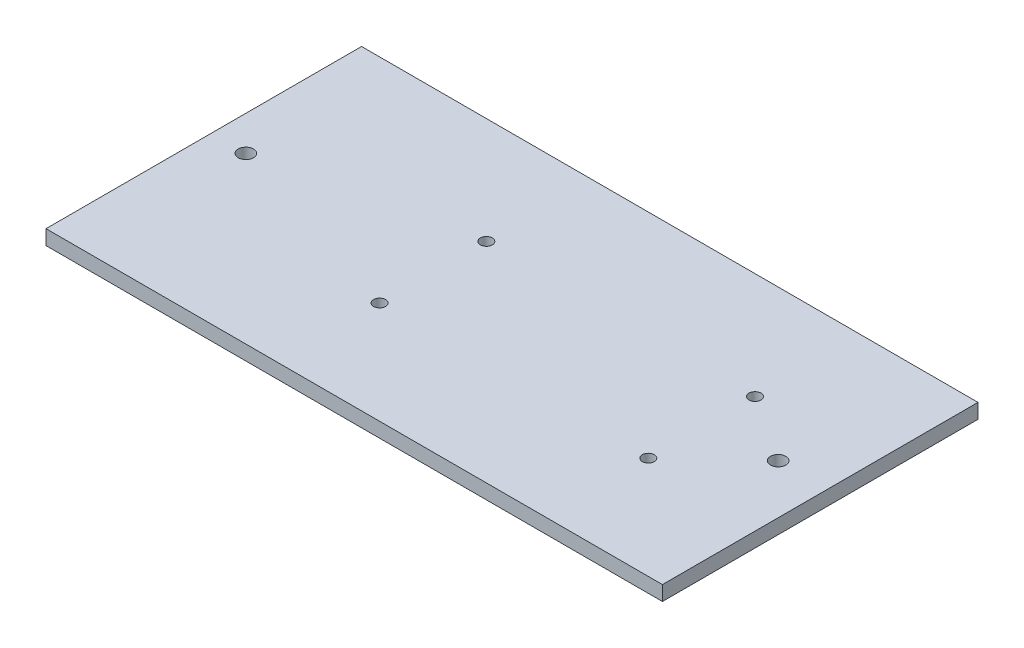
ISO-10303-21;
HEADER;
FILE_DESCRIPTION(('STEP AP214'),'2;1');
FILE_NAME('part.step','',(''),(''),'','','');
FILE_SCHEMA(('AUTOMOTIVE_DESIGN { 1 0 10303 214 1 1 1 1 }'));
ENDSEC;
DATA;
#1=APPLICATION_CONTEXT('core data for automotive mechanical design processes');
#2=APPLICATION_PROTOCOL_DEFINITION('international standard','automotive_design',2000,#1);
#3=PRODUCT_CONTEXT('',#1,'mechanical');
#4=PRODUCT('Part','Part','',(#3));
#5=PRODUCT_RELATED_PRODUCT_CATEGORY('part','',(#4));
#6=PRODUCT_DEFINITION_FORMATION('','',#4);
#7=PRODUCT_DEFINITION_CONTEXT('part definition',#1,'design');
#8=PRODUCT_DEFINITION('design','',#6,#7);
#9=PRODUCT_DEFINITION_SHAPE('','',#8);
#10=(LENGTH_UNIT() NAMED_UNIT(*) SI_UNIT(.MILLI.,.METRE.));
#11=(NAMED_UNIT(*) PLANE_ANGLE_UNIT() SI_UNIT($,.RADIAN.));
#12=(NAMED_UNIT(*) SI_UNIT($,.STERADIAN.) SOLID_ANGLE_UNIT());
#13=UNCERTAINTY_MEASURE_WITH_UNIT(LENGTH_MEASURE(1.E-05),#10,'distance_accuracy_value','');
#14=(GEOMETRIC_REPRESENTATION_CONTEXT(3) GLOBAL_UNCERTAINTY_ASSIGNED_CONTEXT((#13)) GLOBAL_UNIT_ASSIGNED_CONTEXT((#10,
#11,#12)) REPRESENTATION_CONTEXT('',''));
#15=CARTESIAN_POINT('',(0.,0.,0.));
#16=DIRECTION('',(0.,0.,1.));
#17=DIRECTION('',(1.,0.,0.));
#18=AXIS2_PLACEMENT_3D('',#15,#16,#17);
#19=CARTESIAN_POINT('',(0.,3.175,0.));
#20=DIRECTION('',(0.,1.,0.));
#21=DIRECTION('',(0.,0.,1.));
#22=AXIS2_PLACEMENT_3D('',#19,#20,#21);
#23=PLANE('',#22);
#24=CARTESIAN_POINT('',(41.4125,3.175,11.9625));
#25=DIRECTION('',(0.,1.,0.));
#26=DIRECTION('',(0.,0.,1.));
#27=AXIS2_PLACEMENT_3D('',#24,#25,#26);
#28=CIRCLE('',#27,1.3);
#29=CARTESIAN_POINT('',(41.4125,3.175,10.6625));
#30=VERTEX_POINT('',#29);
#31=EDGE_CURVE('E130',#30,#30,#28,.F.);
#32=ORIENTED_EDGE('',*,*,#31,.T.);
#33=EDGE_LOOP('',(#32));
#34=FACE_BOUND('',#33,.T.);
#35=CARTESIAN_POINT('',(41.4125,3.175,-11.0875));
#36=DIRECTION('',(0.,1.,0.));
#37=DIRECTION('',(0.,0.,1.));
#38=AXIS2_PLACEMENT_3D('',#35,#36,#37);
#39=CIRCLE('',#38,1.29999999999999);
#40=CARTESIAN_POINT('',(41.4125,3.175,-12.3875));
#41=VERTEX_POINT('',#40);
#42=EDGE_CURVE('E137',#41,#41,#39,.F.);
#43=ORIENTED_EDGE('',*,*,#42,.T.);
#44=EDGE_LOOP('',(#43));
#45=FACE_BOUND('',#44,.T.);
#46=CARTESIAN_POINT('',(-16.6375,3.175,-11.0875));
#47=DIRECTION('',(0.,1.,0.));
#48=DIRECTION('',(0.,0.,1.));
#49=AXIS2_PLACEMENT_3D('',#46,#47,#48);
#50=CIRCLE('',#49,1.3);
#51=CARTESIAN_POINT('',(-16.6375,3.175,-12.3875));
#52=VERTEX_POINT('',#51);
#53=EDGE_CURVE('E129',#52,#52,#50,.F.);
#54=ORIENTED_EDGE('',*,*,#53,.T.);
#55=EDGE_LOOP('',(#54));
#56=FACE_BOUND('',#55,.T.);
#57=CARTESIAN_POINT('',(-16.6375,3.175,11.9625));
#58=DIRECTION('',(0.,1.,0.));
#59=DIRECTION('',(0.,0.,1.));
#60=AXIS2_PLACEMENT_3D('',#57,#58,#59);
#61=CIRCLE('',#60,1.3);
#62=CARTESIAN_POINT('',(-16.6375,3.175,10.6625));
#63=VERTEX_POINT('',#62);
#64=EDGE_CURVE('E121',#63,#63,#61,.F.);
#65=ORIENTED_EDGE('',*,*,#64,.T.);
#66=EDGE_LOOP('',(#65));
#67=FACE_BOUND('',#66,.T.);
#68=CARTESIAN_POINT('',(-59.0875,3.175,-1.5875));
#69=DIRECTION('',(0.,1.,0.));
#70=DIRECTION('',(0.,0.,1.));
#71=AXIS2_PLACEMENT_3D('',#68,#69,#70);
#72=CIRCLE('',#71,1.65);
#73=CARTESIAN_POINT('',(-59.0875,3.175,0.0625000000000024));
#74=VERTEX_POINT('',#73);
#75=EDGE_CURVE('E100',#74,#74,#72,.T.);
#76=ORIENTED_EDGE('',*,*,#75,.F.);
#77=EDGE_LOOP('',(#76));
#78=FACE_BOUND('',#77,.T.);
#79=DIRECTION('',(0.,0.,-1.));
#80=VECTOR('',#79,1.);
#81=CARTESIAN_POINT('',(66.5875,3.175,-34.0875));
#82=LINE('',#81,#80);
#83=CARTESIAN_POINT('',(66.5875,3.175,34.0875));
#84=VERTEX_POINT('',#83);
#85=CARTESIAN_POINT('',(66.5875,3.175,-34.0875));
#86=VERTEX_POINT('',#85);
#87=EDGE_CURVE('E85',#84,#86,#82,.T.);
#88=ORIENTED_EDGE('',*,*,#87,.T.);
#89=DIRECTION('',(-1.,0.,0.));
#90=VECTOR('',#89,1.);
#91=CARTESIAN_POINT('',(-66.5875,3.175,-34.0875));
#92=LINE('',#91,#90);
#93=CARTESIAN_POINT('',(-66.5875,3.175,-34.0875));
#94=VERTEX_POINT('',#93);
#95=EDGE_CURVE('E80',#86,#94,#92,.T.);
#96=ORIENTED_EDGE('',*,*,#95,.T.);
#97=DIRECTION('',(0.,0.,1.));
#98=VECTOR('',#97,1.);
#99=CARTESIAN_POINT('',(-66.5875,3.175,-34.0875));
#100=LINE('',#99,#98);
#101=CARTESIAN_POINT('',(-66.5875,3.175,34.0875));
#102=VERTEX_POINT('',#101);
#103=EDGE_CURVE('E83',#94,#102,#100,.T.);
#104=ORIENTED_EDGE('',*,*,#103,.T.);
#105=DIRECTION('',(1.,0.,0.));
#106=VECTOR('',#105,1.);
#107=CARTESIAN_POINT('',(-66.5875,3.175,34.0875));
#108=LINE('',#107,#106);
#109=EDGE_CURVE('E50',#102,#84,#108,.T.);
#110=ORIENTED_EDGE('',*,*,#109,.T.);
#111=EDGE_LOOP('',(#88,#96,#104,#110));
#112=FACE_BOUND('',#111,.T.);
#113=CARTESIAN_POINT('',(55.9125,3.175,-1.5875));
#114=DIRECTION('',(0.,1.,0.));
#115=DIRECTION('',(0.,0.,1.));
#116=AXIS2_PLACEMENT_3D('',#113,#114,#115);
#117=CIRCLE('',#116,1.65);
#118=CARTESIAN_POINT('',(55.9125,3.175,0.0625000000000024));
#119=VERTEX_POINT('',#118);
#120=EDGE_CURVE('E115',#119,#119,#117,.T.);
#121=ORIENTED_EDGE('',*,*,#120,.F.);
#122=EDGE_LOOP('',(#121));
#123=FACE_BOUND('',#122,.T.);
#124=ADVANCED_FACE('F33',(#34,#45,#56,#67,#78,#112,#123),#23,.T.);
#125=CARTESIAN_POINT('',(0.,0.,0.));
#126=DIRECTION('',(0.,1.,0.));
#127=DIRECTION('',(0.,0.,1.));
#128=AXIS2_PLACEMENT_3D('',#125,#126,#127);
#129=PLANE('',#128);
#130=CARTESIAN_POINT('',(41.4125,0.,11.9625));
#131=DIRECTION('',(0.,-1.,0.));
#132=DIRECTION('',(0.,0.,-1.));
#133=AXIS2_PLACEMENT_3D('',#130,#131,#132);
#134=CIRCLE('',#133,1.3);
#135=CARTESIAN_POINT('',(41.4125,0.,10.6625));
#136=VERTEX_POINT('',#135);
#137=EDGE_CURVE('E134',#136,#136,#134,.T.);
#138=ORIENTED_EDGE('',*,*,#137,.F.);
#139=EDGE_LOOP('',(#138));
#140=FACE_BOUND('',#139,.T.);
#141=CARTESIAN_POINT('',(41.4125,0.,-11.0875));
#142=DIRECTION('',(0.,-1.,0.));
#143=DIRECTION('',(0.,0.,-1.));
#144=AXIS2_PLACEMENT_3D('',#141,#142,#143);
#145=CIRCLE('',#144,1.29999999999999);
#146=CARTESIAN_POINT('',(41.4125,0.,-12.3875));
#147=VERTEX_POINT('',#146);
#148=EDGE_CURVE('E133',#147,#147,#145,.T.);
#149=ORIENTED_EDGE('',*,*,#148,.F.);
#150=EDGE_LOOP('',(#149));
#151=FACE_BOUND('',#150,.T.);
#152=CARTESIAN_POINT('',(-16.6375,0.,-11.0875));
#153=DIRECTION('',(0.,-1.,0.));
#154=DIRECTION('',(0.,0.,-1.));
#155=AXIS2_PLACEMENT_3D('',#152,#153,#154);
#156=CIRCLE('',#155,1.3);
#157=CARTESIAN_POINT('',(-16.6375,0.,-12.3875));
#158=VERTEX_POINT('',#157);
#159=EDGE_CURVE('E140',#158,#158,#156,.T.);
#160=ORIENTED_EDGE('',*,*,#159,.F.);
#161=EDGE_LOOP('',(#160));
#162=FACE_BOUND('',#161,.T.);
#163=CARTESIAN_POINT('',(-16.6375,0.,11.9625));
#164=DIRECTION('',(0.,-1.,0.));
#165=DIRECTION('',(0.,0.,-1.));
#166=AXIS2_PLACEMENT_3D('',#163,#164,#165);
#167=CIRCLE('',#166,1.3);
#168=CARTESIAN_POINT('',(-16.6375,0.,10.6625));
#169=VERTEX_POINT('',#168);
#170=EDGE_CURVE('E126',#169,#169,#167,.T.);
#171=ORIENTED_EDGE('',*,*,#170,.F.);
#172=EDGE_LOOP('',(#171));
#173=FACE_BOUND('',#172,.T.);
#174=DIRECTION('',(0.,0.,-1.));
#175=VECTOR('',#174,1.);
#176=CARTESIAN_POINT('',(66.5875,0.,-34.0875));
#177=LINE('',#176,#175);
#178=CARTESIAN_POINT('',(66.5875,0.,34.0875));
#179=VERTEX_POINT('',#178);
#180=CARTESIAN_POINT('',(66.5875,0.,-34.0875));
#181=VERTEX_POINT('',#180);
#182=EDGE_CURVE('E97',#179,#181,#177,.T.);
#183=ORIENTED_EDGE('',*,*,#182,.F.);
#184=DIRECTION('',(1.,0.,0.));
#185=VECTOR('',#184,1.);
#186=CARTESIAN_POINT('',(-66.5875,0.,34.0875));
#187=LINE('',#186,#185);
#188=CARTESIAN_POINT('',(-66.5875,0.,34.0875));
#189=VERTEX_POINT('',#188);
#190=EDGE_CURVE('E73',#189,#179,#187,.T.);
#191=ORIENTED_EDGE('',*,*,#190,.F.);
#192=DIRECTION('',(0.,0.,1.));
#193=VECTOR('',#192,1.);
#194=CARTESIAN_POINT('',(-66.5875,0.,-34.0875));
#195=LINE('',#194,#193);
#196=CARTESIAN_POINT('',(-66.5875,0.,-34.0875));
#197=VERTEX_POINT('',#196);
#198=EDGE_CURVE('E67',#197,#189,#195,.T.);
#199=ORIENTED_EDGE('',*,*,#198,.F.);
#200=DIRECTION('',(-1.,0.,0.));
#201=VECTOR('',#200,1.);
#202=CARTESIAN_POINT('',(-66.5875,0.,-34.0875));
#203=LINE('',#202,#201);
#204=EDGE_CURVE('E89',#181,#197,#203,.T.);
#205=ORIENTED_EDGE('',*,*,#204,.F.);
#206=EDGE_LOOP('',(#183,#191,#199,#205));
#207=FACE_BOUND('',#206,.T.);
#208=CARTESIAN_POINT('',(-59.0875,0.,-1.5875));
#209=DIRECTION('',(0.,1.,0.));
#210=DIRECTION('',(0.,0.,1.));
#211=AXIS2_PLACEMENT_3D('',#208,#209,#210);
#212=CIRCLE('',#211,1.65);
#213=CARTESIAN_POINT('',(-59.0875,0.,0.0625000000000024));
#214=VERTEX_POINT('',#213);
#215=EDGE_CURVE('E112',#214,#214,#212,.T.);
#216=ORIENTED_EDGE('',*,*,#215,.T.);
#217=EDGE_LOOP('',(#216));
#218=FACE_BOUND('',#217,.T.);
#219=CARTESIAN_POINT('',(55.9125,0.,-1.5875));
#220=DIRECTION('',(0.,1.,0.));
#221=DIRECTION('',(0.,0.,1.));
#222=AXIS2_PLACEMENT_3D('',#219,#220,#221);
#223=CIRCLE('',#222,1.65);
#224=CARTESIAN_POINT('',(55.9125,0.,0.0625000000000024));
#225=VERTEX_POINT('',#224);
#226=EDGE_CURVE('E118',#225,#225,#223,.T.);
#227=ORIENTED_EDGE('',*,*,#226,.T.);
#228=EDGE_LOOP('',(#227));
#229=FACE_BOUND('',#228,.T.);
#230=ADVANCED_FACE('F108',(#140,#151,#162,#173,#207,#218,#229),#129,.F.);
#231=CARTESIAN_POINT('',(66.5875,3.175,-34.0875));
#232=DIRECTION('',(-1.,0.,0.));
#233=DIRECTION('',(0.,0.,1.));
#234=AXIS2_PLACEMENT_3D('',#231,#232,#233);
#235=PLANE('',#234);
#236=ORIENTED_EDGE('',*,*,#182,.T.);
#237=DIRECTION('',(0.,-1.,0.));
#238=VECTOR('',#237,1.);
#239=CARTESIAN_POINT('',(66.5875,3.175,-34.0875));
#240=LINE('',#239,#238);
#241=EDGE_CURVE('E11',#86,#181,#240,.T.);
#242=ORIENTED_EDGE('',*,*,#241,.F.);
#243=ORIENTED_EDGE('',*,*,#87,.F.);
#244=DIRECTION('',(0.,-1.,0.));
#245=VECTOR('',#244,1.);
#246=CARTESIAN_POINT('',(66.5875,3.175,34.0875));
#247=LINE('',#246,#245);
#248=EDGE_CURVE('E93',#84,#179,#247,.T.);
#249=ORIENTED_EDGE('',*,*,#248,.T.);
#250=EDGE_LOOP('',(#236,#242,#243,#249));
#251=FACE_BOUND('',#250,.T.);
#252=ADVANCED_FACE('F35',(#251),#235,.F.);
#253=CARTESIAN_POINT('',(-66.5875,3.175,-34.0875));
#254=DIRECTION('',(0.,0.,1.));
#255=DIRECTION('',(1.,0.,0.));
#256=AXIS2_PLACEMENT_3D('',#253,#254,#255);
#257=PLANE('',#256);
#258=ORIENTED_EDGE('',*,*,#204,.T.);
#259=DIRECTION('',(0.,-1.,0.));
#260=VECTOR('',#259,1.);
#261=CARTESIAN_POINT('',(-66.5875,3.175,-34.0875));
#262=LINE('',#261,#260);
#263=EDGE_CURVE('E42',#94,#197,#262,.T.);
#264=ORIENTED_EDGE('',*,*,#263,.F.);
#265=ORIENTED_EDGE('',*,*,#95,.F.);
#266=ORIENTED_EDGE('',*,*,#241,.T.);
#267=EDGE_LOOP('',(#258,#264,#265,#266));
#268=FACE_BOUND('',#267,.T.);
#269=ADVANCED_FACE('F88',(#268),#257,.F.);
#270=CARTESIAN_POINT('',(-66.5875,3.175,-34.0875));
#271=DIRECTION('',(1.,0.,0.));
#272=DIRECTION('',(0.,0.,-1.));
#273=AXIS2_PLACEMENT_3D('',#270,#271,#272);
#274=PLANE('',#273);
#275=ORIENTED_EDGE('',*,*,#198,.T.);
#276=DIRECTION('',(0.,-1.,0.));
#277=VECTOR('',#276,1.);
#278=CARTESIAN_POINT('',(-66.5875,3.175,34.0875));
#279=LINE('',#278,#277);
#280=EDGE_CURVE('E90',#102,#189,#279,.T.);
#281=ORIENTED_EDGE('',*,*,#280,.F.);
#282=ORIENTED_EDGE('',*,*,#103,.F.);
#283=ORIENTED_EDGE('',*,*,#263,.T.);
#284=EDGE_LOOP('',(#275,#281,#282,#283));
#285=FACE_BOUND('',#284,.T.);
#286=ADVANCED_FACE('F91',(#285),#274,.F.);
#287=CARTESIAN_POINT('',(-66.5875,3.175,34.0875));
#288=DIRECTION('',(0.,0.,-1.));
#289=DIRECTION('',(-1.,0.,0.));
#290=AXIS2_PLACEMENT_3D('',#287,#288,#289);
#291=PLANE('',#290);
#292=ORIENTED_EDGE('',*,*,#190,.T.);
#293=ORIENTED_EDGE('',*,*,#248,.F.);
#294=ORIENTED_EDGE('',*,*,#109,.F.);
#295=ORIENTED_EDGE('',*,*,#280,.T.);
#296=EDGE_LOOP('',(#292,#293,#294,#295));
#297=FACE_BOUND('',#296,.T.);
#298=ADVANCED_FACE('F105',(#297),#291,.F.);
#299=CARTESIAN_POINT('',(-59.0875,3.175,-1.5875));
#300=DIRECTION('',(0.,-1.,0.));
#301=DIRECTION('',(0.,0.,-1.));
#302=AXIS2_PLACEMENT_3D('',#299,#300,#301);
#303=CYLINDRICAL_SURFACE('',#302,1.65);
#304=ORIENTED_EDGE('',*,*,#75,.T.);
#305=EDGE_LOOP('',(#304));
#306=FACE_BOUND('',#305,.T.);
#307=ORIENTED_EDGE('',*,*,#215,.F.);
#308=EDGE_LOOP('',(#307));
#309=FACE_BOUND('',#308,.T.);
#310=ADVANCED_FACE('F170',(#306,#309),#303,.F.);
#311=CARTESIAN_POINT('',(55.9125,3.175,-1.5875));
#312=DIRECTION('',(0.,-1.,0.));
#313=DIRECTION('',(0.,0.,-1.));
#314=AXIS2_PLACEMENT_3D('',#311,#312,#313);
#315=CYLINDRICAL_SURFACE('',#314,1.65);
#316=ORIENTED_EDGE('',*,*,#120,.T.);
#317=EDGE_LOOP('',(#316));
#318=FACE_BOUND('',#317,.T.);
#319=ORIENTED_EDGE('',*,*,#226,.F.);
#320=EDGE_LOOP('',(#319));
#321=FACE_BOUND('',#320,.T.);
#322=ADVANCED_FACE('F160',(#318,#321),#315,.F.);
#323=CARTESIAN_POINT('',(-16.6375,6.85195526217005,11.9625));
#324=DIRECTION('',(0.,-1.,0.));
#325=DIRECTION('',(0.,0.,-1.));
#326=AXIS2_PLACEMENT_3D('',#323,#324,#325);
#327=CYLINDRICAL_SURFACE('',#326,1.3);
#328=CARTESIAN_POINT('',(-16.6375,0.,10.6625));
#329=CARTESIAN_POINT('',(-16.6375,0.0330729166666668,10.6625));
#330=CARTESIAN_POINT('',(-16.6375,0.0661458333333336,10.6625));
#331=CARTESIAN_POINT('',(-16.6375,0.132291666666667,10.6625));
#332=CARTESIAN_POINT('',(-16.6375,0.165364583333333,10.6625));
#333=CARTESIAN_POINT('',(-16.6375,0.231510416666667,10.6625));
#334=CARTESIAN_POINT('',(-16.6375,0.264583333333333,10.6625));
#335=CARTESIAN_POINT('',(-16.6375,0.330729166666667,10.6625));
#336=CARTESIAN_POINT('',(-16.6375,0.363802083333333,10.6625));
#337=CARTESIAN_POINT('',(-16.6375,0.429947916666666,10.6625));
#338=CARTESIAN_POINT('',(-16.6375,0.463020833333333,10.6625));
#339=CARTESIAN_POINT('',(-16.6375,0.529166666666667,10.6625));
#340=CARTESIAN_POINT('',(-16.6375,0.562239583333334,10.6625));
#341=CARTESIAN_POINT('',(-16.6375,0.628385416666667,10.6625));
#342=CARTESIAN_POINT('',(-16.6375,0.661458333333333,10.6625));
#343=CARTESIAN_POINT('',(-16.6375,0.727604166666667,10.6625));
#344=CARTESIAN_POINT('',(-16.6375,0.760677083333333,10.6625));
#345=CARTESIAN_POINT('',(-16.6375,0.826822916666667,10.6625));
#346=CARTESIAN_POINT('',(-16.6375,0.859895833333333,10.6625));
#347=CARTESIAN_POINT('',(-16.6375,0.926041666666666,10.6625));
#348=CARTESIAN_POINT('',(-16.6375,0.959114583333333,10.6625));
#349=CARTESIAN_POINT('',(-16.6375,1.02526041666667,10.6625));
#350=CARTESIAN_POINT('',(-16.6375,1.05833333333333,10.6625));
#351=CARTESIAN_POINT('',(-16.6375,1.12447916666667,10.6625));
#352=CARTESIAN_POINT('',(-16.6375,1.15755208333333,10.6625));
#353=CARTESIAN_POINT('',(-16.6375,1.22369791666667,10.6625));
#354=CARTESIAN_POINT('',(-16.6375,1.25677083333333,10.6625));
#355=CARTESIAN_POINT('',(-16.6375,1.32291666666667,10.6625));
#356=CARTESIAN_POINT('',(-16.6375,1.35598958333333,10.6625));
#357=CARTESIAN_POINT('',(-16.6375,1.42213541666667,10.6625));
#358=CARTESIAN_POINT('',(-16.6375,1.45520833333333,10.6625));
#359=CARTESIAN_POINT('',(-16.6375,1.52135416666667,10.6625));
#360=CARTESIAN_POINT('',(-16.6375,1.55442708333333,10.6625));
#361=CARTESIAN_POINT('',(-16.6375,1.62057291666667,10.6625));
#362=CARTESIAN_POINT('',(-16.6375,1.65364583333333,10.6625));
#363=CARTESIAN_POINT('',(-16.6375,1.71979166666667,10.6625));
#364=CARTESIAN_POINT('',(-16.6375,1.75286458333333,10.6625));
#365=CARTESIAN_POINT('',(-16.6375,1.81901041666667,10.6625));
#366=CARTESIAN_POINT('',(-16.6375,1.85208333333333,10.6625));
#367=CARTESIAN_POINT('',(-16.6375,1.91822916666667,10.6625));
#368=CARTESIAN_POINT('',(-16.6375,1.95130208333333,10.6625));
#369=CARTESIAN_POINT('',(-16.6375,2.01744791666667,10.6625));
#370=CARTESIAN_POINT('',(-16.6375,2.05052083333333,10.6625));
#371=CARTESIAN_POINT('',(-16.6375,2.11666666666667,10.6625));
#372=CARTESIAN_POINT('',(-16.6375,2.14973958333333,10.6625));
#373=CARTESIAN_POINT('',(-16.6375,2.21588541666667,10.6625));
#374=CARTESIAN_POINT('',(-16.6375,2.24895833333333,10.6625));
#375=CARTESIAN_POINT('',(-16.6375,2.31510416666667,10.6625));
#376=CARTESIAN_POINT('',(-16.6375,2.34817708333333,10.6625));
#377=CARTESIAN_POINT('',(-16.6375,2.41432291666667,10.6625));
#378=CARTESIAN_POINT('',(-16.6375,2.44739583333333,10.6625));
#379=CARTESIAN_POINT('',(-16.6375,2.51354166666667,10.6625));
#380=CARTESIAN_POINT('',(-16.6375,2.54661458333333,10.6625));
#381=CARTESIAN_POINT('',(-16.6375,2.61276041666667,10.6625));
#382=CARTESIAN_POINT('',(-16.6375,2.64583333333333,10.6625));
#383=CARTESIAN_POINT('',(-16.6375,2.71197916666667,10.6625));
#384=CARTESIAN_POINT('',(-16.6375,2.74505208333333,10.6625));
#385=CARTESIAN_POINT('',(-16.6375,2.81119791666667,10.6625));
#386=CARTESIAN_POINT('',(-16.6375,2.84427083333333,10.6625));
#387=CARTESIAN_POINT('',(-16.6375,2.91041666666667,10.6625));
#388=CARTESIAN_POINT('',(-16.6375,2.94348958333333,10.6625));
#389=CARTESIAN_POINT('',(-16.6375,3.00963541666667,10.6625));
#390=CARTESIAN_POINT('',(-16.6375,3.04270833333333,10.6625));
#391=CARTESIAN_POINT('',(-16.6375,3.10885416666667,10.6625));
#392=CARTESIAN_POINT('',(-16.6375,3.14192708333333,10.6625));
#393=CARTESIAN_POINT('',(-16.6375,3.175,10.6625));
#394=B_SPLINE_CURVE_WITH_KNOTS('',3,(#328,#329,#330,#331,#332,#333,#334,#335,#336,#337,#338,
#339,#340,#341,#342,#343,#344,#345,#346,#347,#348,#349,#350,#351,#352,#353,#354,#355,#356,#357,
#358,#359,#360,#361,#362,#363,#364,#365,#366,#367,#368,#369,#370,#371,#372,#373,#374,#375,#376,
#377,#378,#379,#380,#381,#382,#383,#384,#385,#386,#387,#388,#389,#390,#391,#392,#393),
.UNSPECIFIED.,.F.,.F.,(4,2,2,2,2,2,2,2,2,2,2,2,2,2,2,2,2,2,2,2,2,2,2,2,2,2,2,2,2,2,2,2,4),(0.,
0.0992187500000004,0.1984375,0.29765625,0.396875,0.49609375,0.5953125,0.69453125,0.79375,
0.89296875,0.9921875,1.09140625,1.190625,1.28984375,1.3890625,1.48828125,1.5875,1.68671875,
1.7859375,1.88515625,1.984375,2.08359375,2.1828125,2.28203125,2.38125,2.48046875,2.5796875,
2.67890625,2.778125,2.87734375,2.9765625,3.07578125,3.175),.UNSPECIFIED.);
#395=EDGE_CURVE('BSEAM157',#169,#63,#394,.T.);
#396=ORIENTED_EDGE('',*,*,#170,.T.);
#397=ORIENTED_EDGE('',*,*,#64,.F.);
#398=ORIENTED_EDGE('',*,*,#395,.T.);
#399=ORIENTED_EDGE('',*,*,#395,.F.);
#400=EDGE_LOOP('',(#396,#398,#397,#399));
#401=FACE_BOUND('',#400,.T.);
#402=ADVANCED_FACE('F157',(#401),#327,.F.);
#403=CARTESIAN_POINT('',(-16.6375,6.85195526217005,-11.0875));
#404=DIRECTION('',(0.,-1.,0.));
#405=DIRECTION('',(0.,0.,-1.));
#406=AXIS2_PLACEMENT_3D('',#403,#404,#405);
#407=CYLINDRICAL_SURFACE('',#406,1.3);
#408=CARTESIAN_POINT('',(-16.6375,0.,-12.3875));
#409=CARTESIAN_POINT('',(-16.6375,0.0330729166666668,-12.3875));
#410=CARTESIAN_POINT('',(-16.6375,0.0661458333333336,-12.3875));
#411=CARTESIAN_POINT('',(-16.6375,0.132291666666667,-12.3875));
#412=CARTESIAN_POINT('',(-16.6375,0.165364583333333,-12.3875));
#413=CARTESIAN_POINT('',(-16.6375,0.231510416666667,-12.3875));
#414=CARTESIAN_POINT('',(-16.6375,0.264583333333333,-12.3875));
#415=CARTESIAN_POINT('',(-16.6375,0.330729166666667,-12.3875));
#416=CARTESIAN_POINT('',(-16.6375,0.363802083333333,-12.3875));
#417=CARTESIAN_POINT('',(-16.6375,0.429947916666666,-12.3875));
#418=CARTESIAN_POINT('',(-16.6375,0.463020833333333,-12.3875));
#419=CARTESIAN_POINT('',(-16.6375,0.529166666666667,-12.3875));
#420=CARTESIAN_POINT('',(-16.6375,0.562239583333334,-12.3875));
#421=CARTESIAN_POINT('',(-16.6375,0.628385416666667,-12.3875));
#422=CARTESIAN_POINT('',(-16.6375,0.661458333333333,-12.3875));
#423=CARTESIAN_POINT('',(-16.6375,0.727604166666667,-12.3875));
#424=CARTESIAN_POINT('',(-16.6375,0.760677083333333,-12.3875));
#425=CARTESIAN_POINT('',(-16.6375,0.826822916666667,-12.3875));
#426=CARTESIAN_POINT('',(-16.6375,0.859895833333333,-12.3875));
#427=CARTESIAN_POINT('',(-16.6375,0.926041666666666,-12.3875));
#428=CARTESIAN_POINT('',(-16.6375,0.959114583333333,-12.3875));
#429=CARTESIAN_POINT('',(-16.6375,1.02526041666667,-12.3875));
#430=CARTESIAN_POINT('',(-16.6375,1.05833333333333,-12.3875));
#431=CARTESIAN_POINT('',(-16.6375,1.12447916666667,-12.3875));
#432=CARTESIAN_POINT('',(-16.6375,1.15755208333333,-12.3875));
#433=CARTESIAN_POINT('',(-16.6375,1.22369791666667,-12.3875));
#434=CARTESIAN_POINT('',(-16.6375,1.25677083333333,-12.3875));
#435=CARTESIAN_POINT('',(-16.6375,1.32291666666667,-12.3875));
#436=CARTESIAN_POINT('',(-16.6375,1.35598958333333,-12.3875));
#437=CARTESIAN_POINT('',(-16.6375,1.42213541666667,-12.3875));
#438=CARTESIAN_POINT('',(-16.6375,1.45520833333333,-12.3875));
#439=CARTESIAN_POINT('',(-16.6375,1.52135416666667,-12.3875));
#440=CARTESIAN_POINT('',(-16.6375,1.55442708333333,-12.3875));
#441=CARTESIAN_POINT('',(-16.6375,1.62057291666667,-12.3875));
#442=CARTESIAN_POINT('',(-16.6375,1.65364583333333,-12.3875));
#443=CARTESIAN_POINT('',(-16.6375,1.71979166666667,-12.3875));
#444=CARTESIAN_POINT('',(-16.6375,1.75286458333333,-12.3875));
#445=CARTESIAN_POINT('',(-16.6375,1.81901041666667,-12.3875));
#446=CARTESIAN_POINT('',(-16.6375,1.85208333333333,-12.3875));
#447=CARTESIAN_POINT('',(-16.6375,1.91822916666667,-12.3875));
#448=CARTESIAN_POINT('',(-16.6375,1.95130208333333,-12.3875));
#449=CARTESIAN_POINT('',(-16.6375,2.01744791666667,-12.3875));
#450=CARTESIAN_POINT('',(-16.6375,2.05052083333333,-12.3875));
#451=CARTESIAN_POINT('',(-16.6375,2.11666666666667,-12.3875));
#452=CARTESIAN_POINT('',(-16.6375,2.14973958333333,-12.3875));
#453=CARTESIAN_POINT('',(-16.6375,2.21588541666667,-12.3875));
#454=CARTESIAN_POINT('',(-16.6375,2.24895833333333,-12.3875));
#455=CARTESIAN_POINT('',(-16.6375,2.31510416666667,-12.3875));
#456=CARTESIAN_POINT('',(-16.6375,2.34817708333333,-12.3875));
#457=CARTESIAN_POINT('',(-16.6375,2.41432291666667,-12.3875));
#458=CARTESIAN_POINT('',(-16.6375,2.44739583333333,-12.3875));
#459=CARTESIAN_POINT('',(-16.6375,2.51354166666667,-12.3875));
#460=CARTESIAN_POINT('',(-16.6375,2.54661458333333,-12.3875));
#461=CARTESIAN_POINT('',(-16.6375,2.61276041666667,-12.3875));
#462=CARTESIAN_POINT('',(-16.6375,2.64583333333333,-12.3875));
#463=CARTESIAN_POINT('',(-16.6375,2.71197916666667,-12.3875));
#464=CARTESIAN_POINT('',(-16.6375,2.74505208333333,-12.3875));
#465=CARTESIAN_POINT('',(-16.6375,2.81119791666667,-12.3875));
#466=CARTESIAN_POINT('',(-16.6375,2.84427083333333,-12.3875));
#467=CARTESIAN_POINT('',(-16.6375,2.91041666666667,-12.3875));
#468=CARTESIAN_POINT('',(-16.6375,2.94348958333333,-12.3875));
#469=CARTESIAN_POINT('',(-16.6375,3.00963541666667,-12.3875));
#470=CARTESIAN_POINT('',(-16.6375,3.04270833333333,-12.3875));
#471=CARTESIAN_POINT('',(-16.6375,3.10885416666667,-12.3875));
#472=CARTESIAN_POINT('',(-16.6375,3.14192708333333,-12.3875));
#473=CARTESIAN_POINT('',(-16.6375,3.175,-12.3875));
#474=B_SPLINE_CURVE_WITH_KNOTS('',3,(#408,#409,#410,#411,#412,#413,#414,#415,#416,#417,#418,
#419,#420,#421,#422,#423,#424,#425,#426,#427,#428,#429,#430,#431,#432,#433,#434,#435,#436,#437,
#438,#439,#440,#441,#442,#443,#444,#445,#446,#447,#448,#449,#450,#451,#452,#453,#454,#455,#456,
#457,#458,#459,#460,#461,#462,#463,#464,#465,#466,#467,#468,#469,#470,#471,#472,#473),
.UNSPECIFIED.,.F.,.F.,(4,2,2,2,2,2,2,2,2,2,2,2,2,2,2,2,2,2,2,2,2,2,2,2,2,2,2,2,2,2,2,2,4),(0.,
0.0992187500000004,0.1984375,0.29765625,0.396875,0.49609375,0.5953125,0.69453125,0.79375,
0.89296875,0.9921875,1.09140625,1.190625,1.28984375,1.3890625,1.48828125,1.5875,1.68671875,
1.7859375,1.88515625,1.984375,2.08359375,2.1828125,2.28203125,2.38125,2.48046875,2.5796875,
2.67890625,2.778125,2.87734375,2.9765625,3.07578125,3.175),.UNSPECIFIED.);
#475=EDGE_CURVE('BSEAM148',#158,#52,#474,.T.);
#476=ORIENTED_EDGE('',*,*,#159,.T.);
#477=ORIENTED_EDGE('',*,*,#53,.F.);
#478=ORIENTED_EDGE('',*,*,#475,.T.);
#479=ORIENTED_EDGE('',*,*,#475,.F.);
#480=EDGE_LOOP('',(#476,#478,#477,#479));
#481=FACE_BOUND('',#480,.T.);
#482=ADVANCED_FACE('F148',(#481),#407,.F.);
#483=CARTESIAN_POINT('',(41.4125,6.85195526217005,-11.0875));
#484=DIRECTION('',(0.,-1.,0.));
#485=DIRECTION('',(0.,0.,-1.));
#486=AXIS2_PLACEMENT_3D('',#483,#484,#485);
#487=CYLINDRICAL_SURFACE('',#486,1.29999999999999);
#488=CARTESIAN_POINT('',(41.4125,0.,-12.3875));
#489=CARTESIAN_POINT('',(41.4125,0.0330729166666668,-12.3875));
#490=CARTESIAN_POINT('',(41.4125,0.0661458333333336,-12.3875));
#491=CARTESIAN_POINT('',(41.4125,0.132291666666667,-12.3875));
#492=CARTESIAN_POINT('',(41.4125,0.165364583333333,-12.3875));
#493=CARTESIAN_POINT('',(41.4125,0.231510416666667,-12.3875));
#494=CARTESIAN_POINT('',(41.4125,0.264583333333333,-12.3875));
#495=CARTESIAN_POINT('',(41.4125,0.330729166666667,-12.3875));
#496=CARTESIAN_POINT('',(41.4125,0.363802083333333,-12.3875));
#497=CARTESIAN_POINT('',(41.4125,0.429947916666666,-12.3875));
#498=CARTESIAN_POINT('',(41.4125,0.463020833333333,-12.3875));
#499=CARTESIAN_POINT('',(41.4125,0.529166666666667,-12.3875));
#500=CARTESIAN_POINT('',(41.4125,0.562239583333334,-12.3875));
#501=CARTESIAN_POINT('',(41.4125,0.628385416666667,-12.3875));
#502=CARTESIAN_POINT('',(41.4125,0.661458333333333,-12.3875));
#503=CARTESIAN_POINT('',(41.4125,0.727604166666667,-12.3875));
#504=CARTESIAN_POINT('',(41.4125,0.760677083333333,-12.3875));
#505=CARTESIAN_POINT('',(41.4125,0.826822916666667,-12.3875));
#506=CARTESIAN_POINT('',(41.4125,0.859895833333333,-12.3875));
#507=CARTESIAN_POINT('',(41.4125,0.926041666666666,-12.3875));
#508=CARTESIAN_POINT('',(41.4125,0.959114583333333,-12.3875));
#509=CARTESIAN_POINT('',(41.4125,1.02526041666667,-12.3875));
#510=CARTESIAN_POINT('',(41.4125,1.05833333333333,-12.3875));
#511=CARTESIAN_POINT('',(41.4125,1.12447916666667,-12.3875));
#512=CARTESIAN_POINT('',(41.4125,1.15755208333333,-12.3875));
#513=CARTESIAN_POINT('',(41.4125,1.22369791666667,-12.3875));
#514=CARTESIAN_POINT('',(41.4125,1.25677083333333,-12.3875));
#515=CARTESIAN_POINT('',(41.4125,1.32291666666667,-12.3875));
#516=CARTESIAN_POINT('',(41.4125,1.35598958333333,-12.3875));
#517=CARTESIAN_POINT('',(41.4125,1.42213541666667,-12.3875));
#518=CARTESIAN_POINT('',(41.4125,1.45520833333333,-12.3875));
#519=CARTESIAN_POINT('',(41.4125,1.52135416666667,-12.3875));
#520=CARTESIAN_POINT('',(41.4125,1.55442708333333,-12.3875));
#521=CARTESIAN_POINT('',(41.4125,1.62057291666667,-12.3875));
#522=CARTESIAN_POINT('',(41.4125,1.65364583333333,-12.3875));
#523=CARTESIAN_POINT('',(41.4125,1.71979166666667,-12.3875));
#524=CARTESIAN_POINT('',(41.4125,1.75286458333333,-12.3875));
#525=CARTESIAN_POINT('',(41.4125,1.81901041666667,-12.3875));
#526=CARTESIAN_POINT('',(41.4125,1.85208333333333,-12.3875));
#527=CARTESIAN_POINT('',(41.4125,1.91822916666667,-12.3875));
#528=CARTESIAN_POINT('',(41.4125,1.95130208333333,-12.3875));
#529=CARTESIAN_POINT('',(41.4125,2.01744791666667,-12.3875));
#530=CARTESIAN_POINT('',(41.4125,2.05052083333333,-12.3875));
#531=CARTESIAN_POINT('',(41.4125,2.11666666666667,-12.3875));
#532=CARTESIAN_POINT('',(41.4125,2.14973958333333,-12.3875));
#533=CARTESIAN_POINT('',(41.4125,2.21588541666667,-12.3875));
#534=CARTESIAN_POINT('',(41.4125,2.24895833333333,-12.3875));
#535=CARTESIAN_POINT('',(41.4125,2.31510416666667,-12.3875));
#536=CARTESIAN_POINT('',(41.4125,2.34817708333333,-12.3875));
#537=CARTESIAN_POINT('',(41.4125,2.41432291666667,-12.3875));
#538=CARTESIAN_POINT('',(41.4125,2.44739583333333,-12.3875));
#539=CARTESIAN_POINT('',(41.4125,2.51354166666667,-12.3875));
#540=CARTESIAN_POINT('',(41.4125,2.54661458333333,-12.3875));
#541=CARTESIAN_POINT('',(41.4125,2.61276041666667,-12.3875));
#542=CARTESIAN_POINT('',(41.4125,2.64583333333333,-12.3875));
#543=CARTESIAN_POINT('',(41.4125,2.71197916666667,-12.3875));
#544=CARTESIAN_POINT('',(41.4125,2.74505208333333,-12.3875));
#545=CARTESIAN_POINT('',(41.4125,2.81119791666667,-12.3875));
#546=CARTESIAN_POINT('',(41.4125,2.84427083333333,-12.3875));
#547=CARTESIAN_POINT('',(41.4125,2.91041666666667,-12.3875));
#548=CARTESIAN_POINT('',(41.4125,2.94348958333333,-12.3875));
#549=CARTESIAN_POINT('',(41.4125,3.00963541666667,-12.3875));
#550=CARTESIAN_POINT('',(41.4125,3.04270833333333,-12.3875));
#551=CARTESIAN_POINT('',(41.4125,3.10885416666667,-12.3875));
#552=CARTESIAN_POINT('',(41.4125,3.14192708333333,-12.3875));
#553=CARTESIAN_POINT('',(41.4125,3.175,-12.3875));
#554=B_SPLINE_CURVE_WITH_KNOTS('',3,(#488,#489,#490,#491,#492,#493,#494,#495,#496,#497,#498,
#499,#500,#501,#502,#503,#504,#505,#506,#507,#508,#509,#510,#511,#512,#513,#514,#515,#516,#517,
#518,#519,#520,#521,#522,#523,#524,#525,#526,#527,#528,#529,#530,#531,#532,#533,#534,#535,#536,
#537,#538,#539,#540,#541,#542,#543,#544,#545,#546,#547,#548,#549,#550,#551,#552,#553),
.UNSPECIFIED.,.F.,.F.,(4,2,2,2,2,2,2,2,2,2,2,2,2,2,2,2,2,2,2,2,2,2,2,2,2,2,2,2,2,2,2,2,4),(0.,
0.0992187500000004,0.1984375,0.29765625,0.396875,0.49609375,0.5953125,0.69453125,0.79375,
0.89296875,0.9921875,1.09140625,1.190625,1.28984375,1.3890625,1.48828125,1.5875,1.68671875,
1.7859375,1.88515625,1.984375,2.08359375,2.1828125,2.28203125,2.38125,2.48046875,2.5796875,
2.67890625,2.778125,2.87734375,2.9765625,3.07578125,3.175),.UNSPECIFIED.);
#555=EDGE_CURVE('BSEAM247',#147,#41,#554,.T.);
#556=ORIENTED_EDGE('',*,*,#148,.T.);
#557=ORIENTED_EDGE('',*,*,#42,.F.);
#558=ORIENTED_EDGE('',*,*,#555,.T.);
#559=ORIENTED_EDGE('',*,*,#555,.F.);
#560=EDGE_LOOP('',(#556,#558,#557,#559));
#561=FACE_BOUND('',#560,.T.);
#562=ADVANCED_FACE('F247',(#561),#487,.F.);
#563=CARTESIAN_POINT('',(41.4125,6.85195526217005,11.9625));
#564=DIRECTION('',(0.,-1.,0.));
#565=DIRECTION('',(0.,0.,-1.));
#566=AXIS2_PLACEMENT_3D('',#563,#564,#565);
#567=CYLINDRICAL_SURFACE('',#566,1.3);
#568=CARTESIAN_POINT('',(41.4125,0.,10.6625));
#569=CARTESIAN_POINT('',(41.4125,0.0330729166666668,10.6625));
#570=CARTESIAN_POINT('',(41.4125,0.0661458333333336,10.6625));
#571=CARTESIAN_POINT('',(41.4125,0.132291666666667,10.6625));
#572=CARTESIAN_POINT('',(41.4125,0.165364583333333,10.6625));
#573=CARTESIAN_POINT('',(41.4125,0.231510416666667,10.6625));
#574=CARTESIAN_POINT('',(41.4125,0.264583333333333,10.6625));
#575=CARTESIAN_POINT('',(41.4125,0.330729166666667,10.6625));
#576=CARTESIAN_POINT('',(41.4125,0.363802083333333,10.6625));
#577=CARTESIAN_POINT('',(41.4125,0.429947916666666,10.6625));
#578=CARTESIAN_POINT('',(41.4125,0.463020833333333,10.6625));
#579=CARTESIAN_POINT('',(41.4125,0.529166666666667,10.6625));
#580=CARTESIAN_POINT('',(41.4125,0.562239583333334,10.6625));
#581=CARTESIAN_POINT('',(41.4125,0.628385416666667,10.6625));
#582=CARTESIAN_POINT('',(41.4125,0.661458333333333,10.6625));
#583=CARTESIAN_POINT('',(41.4125,0.727604166666667,10.6625));
#584=CARTESIAN_POINT('',(41.4125,0.760677083333333,10.6625));
#585=CARTESIAN_POINT('',(41.4125,0.826822916666667,10.6625));
#586=CARTESIAN_POINT('',(41.4125,0.859895833333333,10.6625));
#587=CARTESIAN_POINT('',(41.4125,0.926041666666666,10.6625));
#588=CARTESIAN_POINT('',(41.4125,0.959114583333333,10.6625));
#589=CARTESIAN_POINT('',(41.4125,1.02526041666667,10.6625));
#590=CARTESIAN_POINT('',(41.4125,1.05833333333333,10.6625));
#591=CARTESIAN_POINT('',(41.4125,1.12447916666667,10.6625));
#592=CARTESIAN_POINT('',(41.4125,1.15755208333333,10.6625));
#593=CARTESIAN_POINT('',(41.4125,1.22369791666667,10.6625));
#594=CARTESIAN_POINT('',(41.4125,1.25677083333333,10.6625));
#595=CARTESIAN_POINT('',(41.4125,1.32291666666667,10.6625));
#596=CARTESIAN_POINT('',(41.4125,1.35598958333333,10.6625));
#597=CARTESIAN_POINT('',(41.4125,1.42213541666667,10.6625));
#598=CARTESIAN_POINT('',(41.4125,1.45520833333333,10.6625));
#599=CARTESIAN_POINT('',(41.4125,1.52135416666667,10.6625));
#600=CARTESIAN_POINT('',(41.4125,1.55442708333333,10.6625));
#601=CARTESIAN_POINT('',(41.4125,1.62057291666667,10.6625));
#602=CARTESIAN_POINT('',(41.4125,1.65364583333333,10.6625));
#603=CARTESIAN_POINT('',(41.4125,1.71979166666667,10.6625));
#604=CARTESIAN_POINT('',(41.4125,1.75286458333333,10.6625));
#605=CARTESIAN_POINT('',(41.4125,1.81901041666667,10.6625));
#606=CARTESIAN_POINT('',(41.4125,1.85208333333333,10.6625));
#607=CARTESIAN_POINT('',(41.4125,1.91822916666667,10.6625));
#608=CARTESIAN_POINT('',(41.4125,1.95130208333333,10.6625));
#609=CARTESIAN_POINT('',(41.4125,2.01744791666667,10.6625));
#610=CARTESIAN_POINT('',(41.4125,2.05052083333333,10.6625));
#611=CARTESIAN_POINT('',(41.4125,2.11666666666667,10.6625));
#612=CARTESIAN_POINT('',(41.4125,2.14973958333333,10.6625));
#613=CARTESIAN_POINT('',(41.4125,2.21588541666667,10.6625));
#614=CARTESIAN_POINT('',(41.4125,2.24895833333333,10.6625));
#615=CARTESIAN_POINT('',(41.4125,2.31510416666667,10.6625));
#616=CARTESIAN_POINT('',(41.4125,2.34817708333333,10.6625));
#617=CARTESIAN_POINT('',(41.4125,2.41432291666667,10.6625));
#618=CARTESIAN_POINT('',(41.4125,2.44739583333333,10.6625));
#619=CARTESIAN_POINT('',(41.4125,2.51354166666667,10.6625));
#620=CARTESIAN_POINT('',(41.4125,2.54661458333333,10.6625));
#621=CARTESIAN_POINT('',(41.4125,2.61276041666667,10.6625));
#622=CARTESIAN_POINT('',(41.4125,2.64583333333333,10.6625));
#623=CARTESIAN_POINT('',(41.4125,2.71197916666667,10.6625));
#624=CARTESIAN_POINT('',(41.4125,2.74505208333333,10.6625));
#625=CARTESIAN_POINT('',(41.4125,2.81119791666667,10.6625));
#626=CARTESIAN_POINT('',(41.4125,2.84427083333333,10.6625));
#627=CARTESIAN_POINT('',(41.4125,2.91041666666667,10.6625));
#628=CARTESIAN_POINT('',(41.4125,2.94348958333333,10.6625));
#629=CARTESIAN_POINT('',(41.4125,3.00963541666667,10.6625));
#630=CARTESIAN_POINT('',(41.4125,3.04270833333333,10.6625));
#631=CARTESIAN_POINT('',(41.4125,3.10885416666667,10.6625));
#632=CARTESIAN_POINT('',(41.4125,3.14192708333333,10.6625));
#633=CARTESIAN_POINT('',(41.4125,3.175,10.6625));
#634=B_SPLINE_CURVE_WITH_KNOTS('',3,(#568,#569,#570,#571,#572,#573,#574,#575,#576,#577,#578,
#579,#580,#581,#582,#583,#584,#585,#586,#587,#588,#589,#590,#591,#592,#593,#594,#595,#596,#597,
#598,#599,#600,#601,#602,#603,#604,#605,#606,#607,#608,#609,#610,#611,#612,#613,#614,#615,#616,
#617,#618,#619,#620,#621,#622,#623,#624,#625,#626,#627,#628,#629,#630,#631,#632,#633),
.UNSPECIFIED.,.F.,.F.,(4,2,2,2,2,2,2,2,2,2,2,2,2,2,2,2,2,2,2,2,2,2,2,2,2,2,2,2,2,2,2,2,4),(0.,
0.0992187500000004,0.1984375,0.29765625,0.396875,0.49609375,0.5953125,0.69453125,0.79375,
0.89296875,0.9921875,1.09140625,1.190625,1.28984375,1.3890625,1.48828125,1.5875,1.68671875,
1.7859375,1.88515625,1.984375,2.08359375,2.1828125,2.28203125,2.38125,2.48046875,2.5796875,
2.67890625,2.778125,2.87734375,2.9765625,3.07578125,3.175),.UNSPECIFIED.);
#635=EDGE_CURVE('BSEAM255',#136,#30,#634,.T.);
#636=ORIENTED_EDGE('',*,*,#137,.T.);
#637=ORIENTED_EDGE('',*,*,#31,.F.);
#638=ORIENTED_EDGE('',*,*,#635,.T.);
#639=ORIENTED_EDGE('',*,*,#635,.F.);
#640=EDGE_LOOP('',(#636,#638,#637,#639));
#641=FACE_BOUND('',#640,.T.);
#642=ADVANCED_FACE('F255',(#641),#567,.F.);
#643=CLOSED_SHELL('',(#124,#230,#252,#269,#286,#298,#310,#322,#402,#482,#562,#642));
#644=MANIFOLD_SOLID_BREP('B2',#643);
#645=ADVANCED_BREP_SHAPE_REPRESENTATION('',(#18,#644),#14);
#646=SHAPE_DEFINITION_REPRESENTATION(#9,#645);
ENDSEC;
END-ISO-10303-21;
